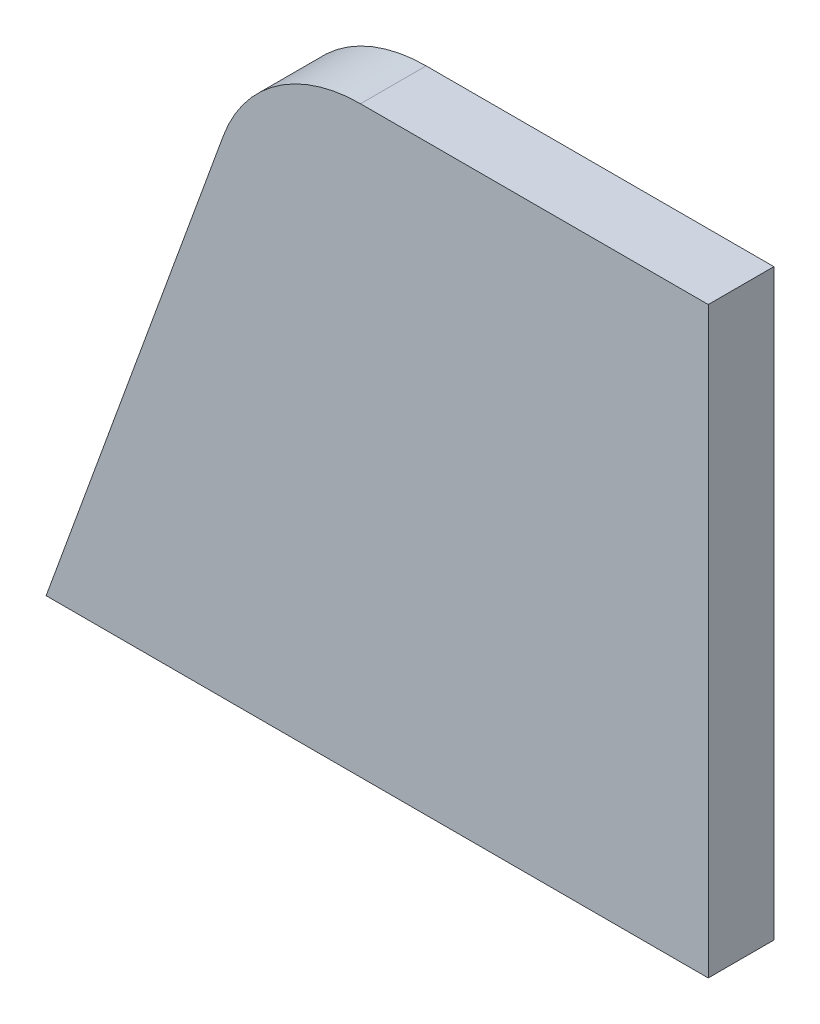
ISO-10303-21;
HEADER;
FILE_DESCRIPTION(('STEP AP214'),'2;1');
FILE_NAME('part.step','',(''),(''),'','','');
FILE_SCHEMA(('AUTOMOTIVE_DESIGN { 1 0 10303 214 1 1 1 1 }'));
ENDSEC;
DATA;
#1=APPLICATION_CONTEXT('core data for automotive mechanical design processes');
#2=APPLICATION_PROTOCOL_DEFINITION('international standard','automotive_design',2000,#1);
#3=PRODUCT_CONTEXT('',#1,'mechanical');
#4=PRODUCT('Part','Part','',(#3));
#5=PRODUCT_RELATED_PRODUCT_CATEGORY('part','',(#4));
#6=PRODUCT_DEFINITION_FORMATION('','',#4);
#7=PRODUCT_DEFINITION_CONTEXT('part definition',#1,'design');
#8=PRODUCT_DEFINITION('design','',#6,#7);
#9=PRODUCT_DEFINITION_SHAPE('','',#8);
#10=(LENGTH_UNIT() NAMED_UNIT(*) SI_UNIT(.MILLI.,.METRE.));
#11=(NAMED_UNIT(*) PLANE_ANGLE_UNIT() SI_UNIT($,.RADIAN.));
#12=(NAMED_UNIT(*) SI_UNIT($,.STERADIAN.) SOLID_ANGLE_UNIT());
#13=UNCERTAINTY_MEASURE_WITH_UNIT(LENGTH_MEASURE(1.E-05),#10,'distance_accuracy_value','');
#14=(GEOMETRIC_REPRESENTATION_CONTEXT(3) GLOBAL_UNCERTAINTY_ASSIGNED_CONTEXT((#13)) GLOBAL_UNIT_ASSIGNED_CONTEXT((#10,
#11,#12)) REPRESENTATION_CONTEXT('',''));
#15=CARTESIAN_POINT('',(0.,0.,0.));
#16=DIRECTION('',(0.,0.,1.));
#17=DIRECTION('',(1.,0.,0.));
#18=AXIS2_PLACEMENT_3D('',#15,#16,#17);
#19=CARTESIAN_POINT('',(71.0802696621447,1175.79882599469,180.));
#20=DIRECTION('',(0.,0.,-1.));
#21=DIRECTION('',(-1.,0.,0.));
#22=AXIS2_PLACEMENT_3D('',#19,#20,#21);
#23=CYLINDRICAL_SURFACE('',#22,400.);
#24=CARTESIAN_POINT('',(71.0802696621447,1175.79882599469,0.));
#25=DIRECTION('',(0.,0.,1.));
#26=DIRECTION('',(1.,0.,0.));
#27=AXIS2_PLACEMENT_3D('',#24,#25,#26);
#28=CIRCLE('',#27,400.);
#29=CARTESIAN_POINT('',(71.0802696621446,1575.79882599469,0.));
#30=VERTEX_POINT('',#29);
#31=CARTESIAN_POINT('',(-304.797264549883,1312.60554832472,0.));
#32=VERTEX_POINT('',#31);
#33=EDGE_CURVE('E108',#30,#32,#28,.T.);
#34=ORIENTED_EDGE('',*,*,#33,.T.);
#35=DIRECTION('',(0.,0.,-1.));
#36=VECTOR('',#35,1.);
#37=CARTESIAN_POINT('',(-304.797264549883,1312.60554832472,180.));
#38=LINE('',#37,#36);
#39=CARTESIAN_POINT('',(-304.797264549883,1312.60554832472,180.));
#40=VERTEX_POINT('',#39);
#41=EDGE_CURVE('E11',#40,#32,#38,.T.);
#42=ORIENTED_EDGE('',*,*,#41,.F.);
#43=CARTESIAN_POINT('',(71.0802696621447,1175.79882599469,180.));
#44=DIRECTION('',(0.,0.,1.));
#45=DIRECTION('',(1.,0.,0.));
#46=AXIS2_PLACEMENT_3D('',#43,#44,#45);
#47=CIRCLE('',#46,400.);
#48=CARTESIAN_POINT('',(71.0802696621446,1575.79882599469,180.));
#49=VERTEX_POINT('',#48);
#50=EDGE_CURVE('E116',#49,#40,#47,.T.);
#51=ORIENTED_EDGE('',*,*,#50,.F.);
#52=DIRECTION('',(0.,0.,-1.));
#53=VECTOR('',#52,1.);
#54=CARTESIAN_POINT('',(71.0802696621446,1575.79882599469,180.));
#55=LINE('',#54,#53);
#56=EDGE_CURVE('E104',#49,#30,#55,.T.);
#57=ORIENTED_EDGE('',*,*,#56,.T.);
#58=EDGE_LOOP('',(#34,#42,#51,#57));
#59=FACE_BOUND('',#58,.T.);
#60=ADVANCED_FACE('F34',(#59),#23,.T.);
#61=CARTESIAN_POINT('',(-304.797264549883,1312.60554832472,180.));
#62=DIRECTION('',(0.939692620785907,-0.342020143325673,0.));
#63=DIRECTION('',(0.342020143325673,0.939692620785907,0.));
#64=AXIS2_PLACEMENT_3D('',#61,#62,#63);
#65=PLANE('',#64);
#66=DIRECTION('',(-0.342020143325673,-0.939692620785907,0.));
#67=VECTOR('',#66,1.);
#68=CARTESIAN_POINT('',(-304.797264549883,1312.60554832472,0.));
#69=LINE('',#68,#67);
#70=CARTESIAN_POINT('',(-791.355120444984,-24.201174005314,0.));
#71=VERTEX_POINT('',#70);
#72=EDGE_CURVE('E111',#32,#71,#69,.T.);
#73=ORIENTED_EDGE('',*,*,#72,.T.);
#74=DIRECTION('',(0.,0.,-1.));
#75=VECTOR('',#74,1.);
#76=CARTESIAN_POINT('',(-791.355120444984,-24.201174005314,180.));
#77=LINE('',#76,#75);
#78=CARTESIAN_POINT('',(-791.355120444984,-24.201174005314,180.));
#79=VERTEX_POINT('',#78);
#80=EDGE_CURVE('E42',#79,#71,#77,.T.);
#81=ORIENTED_EDGE('',*,*,#80,.F.);
#82=DIRECTION('',(-0.342020143325673,-0.939692620785907,0.));
#83=VECTOR('',#82,1.);
#84=CARTESIAN_POINT('',(-304.797264549883,1312.60554832472,180.));
#85=LINE('',#84,#83);
#86=EDGE_CURVE('E84',#40,#79,#85,.T.);
#87=ORIENTED_EDGE('',*,*,#86,.F.);
#88=ORIENTED_EDGE('',*,*,#41,.T.);
#89=EDGE_LOOP('',(#73,#81,#87,#88));
#90=FACE_BOUND('',#89,.T.);
#91=ADVANCED_FACE('F135',(#90),#65,.F.);
#92=CARTESIAN_POINT('',(-791.355120444984,-24.201174005314,180.));
#93=DIRECTION('',(0.,1.,0.));
#94=DIRECTION('',(0.,0.,1.));
#95=AXIS2_PLACEMENT_3D('',#92,#93,#94);
#96=PLANE('',#95);
#97=DIRECTION('',(1.,0.,0.));
#98=VECTOR('',#97,1.);
#99=CARTESIAN_POINT('',(-791.355120444984,-24.201174005314,0.));
#100=LINE('',#99,#98);
#101=CARTESIAN_POINT('',(1025.02487955502,-24.201174005314,0.));
#102=VERTEX_POINT('',#101);
#103=EDGE_CURVE('E99',#71,#102,#100,.T.);
#104=ORIENTED_EDGE('',*,*,#103,.T.);
#105=DIRECTION('',(0.,0.,-1.));
#106=VECTOR('',#105,1.);
#107=CARTESIAN_POINT('',(1025.02487955502,-24.201174005314,180.));
#108=LINE('',#107,#106);
#109=CARTESIAN_POINT('',(1025.02487955502,-24.201174005314,180.));
#110=VERTEX_POINT('',#109);
#111=EDGE_CURVE('E96',#110,#102,#108,.T.);
#112=ORIENTED_EDGE('',*,*,#111,.F.);
#113=DIRECTION('',(1.,0.,0.));
#114=VECTOR('',#113,1.);
#115=CARTESIAN_POINT('',(-791.355120444984,-24.201174005314,180.));
#116=LINE('',#115,#114);
#117=EDGE_CURVE('E88',#79,#110,#116,.T.);
#118=ORIENTED_EDGE('',*,*,#117,.F.);
#119=ORIENTED_EDGE('',*,*,#80,.T.);
#120=EDGE_LOOP('',(#104,#112,#118,#119));
#121=FACE_BOUND('',#120,.T.);
#122=ADVANCED_FACE('F97',(#121),#96,.F.);
#123=CARTESIAN_POINT('',(1025.02487955502,-24.201174005314,180.));
#124=DIRECTION('',(-1.,0.,0.));
#125=DIRECTION('',(0.,-1.,0.));
#126=AXIS2_PLACEMENT_3D('',#123,#124,#125);
#127=PLANE('',#126);
#128=DIRECTION('',(0.,1.,0.));
#129=VECTOR('',#128,1.);
#130=CARTESIAN_POINT('',(1025.02487955502,-24.201174005314,0.));
#131=LINE('',#130,#129);
#132=CARTESIAN_POINT('',(1025.02487955502,1575.79882599469,0.));
#133=VERTEX_POINT('',#132);
#134=EDGE_CURVE('E70',#102,#133,#131,.T.);
#135=ORIENTED_EDGE('',*,*,#134,.T.);
#136=DIRECTION('',(0.,0.,-1.));
#137=VECTOR('',#136,1.);
#138=CARTESIAN_POINT('',(1025.02487955502,1575.79882599469,180.));
#139=LINE('',#138,#137);
#140=CARTESIAN_POINT('',(1025.02487955502,1575.79882599469,180.));
#141=VERTEX_POINT('',#140);
#142=EDGE_CURVE('E100',#141,#133,#139,.T.);
#143=ORIENTED_EDGE('',*,*,#142,.F.);
#144=DIRECTION('',(0.,1.,0.));
#145=VECTOR('',#144,1.);
#146=CARTESIAN_POINT('',(1025.02487955502,-24.201174005314,180.));
#147=LINE('',#146,#145);
#148=EDGE_CURVE('E92',#110,#141,#147,.T.);
#149=ORIENTED_EDGE('',*,*,#148,.F.);
#150=ORIENTED_EDGE('',*,*,#111,.T.);
#151=EDGE_LOOP('',(#135,#143,#149,#150));
#152=FACE_BOUND('',#151,.T.);
#153=ADVANCED_FACE('F102',(#152),#127,.F.);
#154=CARTESIAN_POINT('',(1025.02487955502,1575.79882599469,180.));
#155=DIRECTION('',(0.,-1.,0.));
#156=DIRECTION('',(1.,0.,0.));
#157=AXIS2_PLACEMENT_3D('',#154,#155,#156);
#158=PLANE('',#157);
#159=DIRECTION('',(-1.,0.,0.));
#160=VECTOR('',#159,1.);
#161=CARTESIAN_POINT('',(1025.02487955502,1575.79882599469,0.));
#162=LINE('',#161,#160);
#163=EDGE_CURVE('E76',#133,#30,#162,.T.);
#164=ORIENTED_EDGE('',*,*,#163,.T.);
#165=ORIENTED_EDGE('',*,*,#56,.F.);
#166=DIRECTION('',(-1.,0.,0.));
#167=VECTOR('',#166,1.);
#168=CARTESIAN_POINT('',(1025.02487955502,1575.79882599469,180.));
#169=LINE('',#168,#167);
#170=EDGE_CURVE('E50',#141,#49,#169,.T.);
#171=ORIENTED_EDGE('',*,*,#170,.F.);
#172=ORIENTED_EDGE('',*,*,#142,.T.);
#173=EDGE_LOOP('',(#164,#165,#171,#172));
#174=FACE_BOUND('',#173,.T.);
#175=ADVANCED_FACE('F124',(#174),#158,.F.);
#176=CARTESIAN_POINT('',(71.0802696621447,1175.79882599469,180.));
#177=DIRECTION('',(0.,0.,1.));
#178=DIRECTION('',(1.,0.,0.));
#179=AXIS2_PLACEMENT_3D('',#176,#177,#178);
#180=PLANE('',#179);
#181=ORIENTED_EDGE('',*,*,#50,.T.);
#182=ORIENTED_EDGE('',*,*,#86,.T.);
#183=ORIENTED_EDGE('',*,*,#117,.T.);
#184=ORIENTED_EDGE('',*,*,#148,.T.);
#185=ORIENTED_EDGE('',*,*,#170,.T.);
#186=EDGE_LOOP('',(#181,#182,#183,#184,#185));
#187=FACE_BOUND('',#186,.T.);
#188=ADVANCED_FACE('F90',(#187),#180,.T.);
#189=CARTESIAN_POINT('',(71.0802696621447,1175.79882599469,0.));
#190=DIRECTION('',(0.,0.,1.));
#191=DIRECTION('',(1.,0.,0.));
#192=AXIS2_PLACEMENT_3D('',#189,#190,#191);
#193=PLANE('',#192);
#194=ORIENTED_EDGE('',*,*,#33,.F.);
#195=ORIENTED_EDGE('',*,*,#163,.F.);
#196=ORIENTED_EDGE('',*,*,#134,.F.);
#197=ORIENTED_EDGE('',*,*,#103,.F.);
#198=ORIENTED_EDGE('',*,*,#72,.F.);
#199=EDGE_LOOP('',(#194,#195,#196,#197,#198));
#200=FACE_BOUND('',#199,.T.);
#201=ADVANCED_FACE('F120',(#200),#193,.F.);
#202=CLOSED_SHELL('',(#60,#91,#122,#153,#175,#188,#201));
#203=MANIFOLD_SOLID_BREP('B2',#202);
#204=ADVANCED_BREP_SHAPE_REPRESENTATION('',(#18,#203),#14);
#205=SHAPE_DEFINITION_REPRESENTATION(#9,#204);
ENDSEC;
END-ISO-10303-21;
